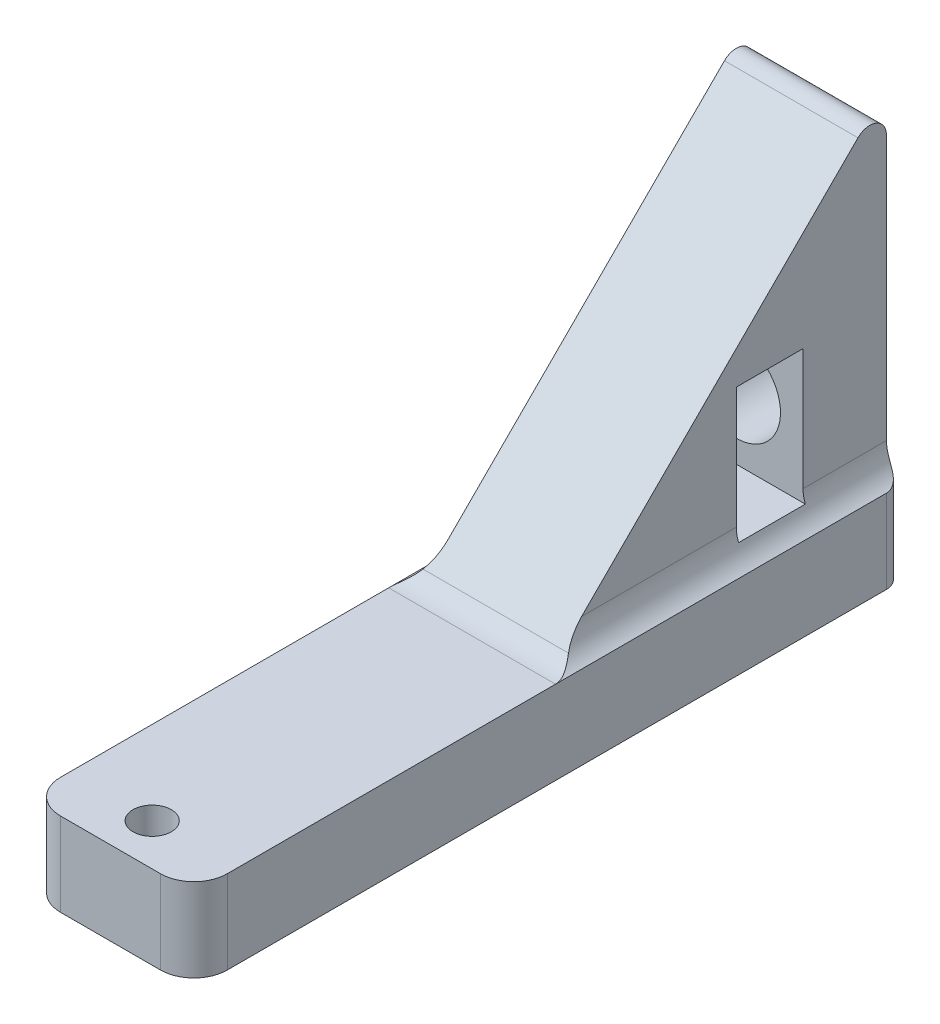
ISO-10303-21;
HEADER;
FILE_DESCRIPTION(('STEP AP214'),'2;1');
FILE_NAME('part.step','',(''),(''),'','','');
FILE_SCHEMA(('AUTOMOTIVE_DESIGN { 1 0 10303 214 1 1 1 1 }'));
ENDSEC;
DATA;
#1=APPLICATION_CONTEXT('core data for automotive mechanical design processes');
#2=APPLICATION_PROTOCOL_DEFINITION('international standard','automotive_design',2000,#1);
#3=PRODUCT_CONTEXT('',#1,'mechanical');
#4=PRODUCT('Part','Part','',(#3));
#5=PRODUCT_RELATED_PRODUCT_CATEGORY('part','',(#4));
#6=PRODUCT_DEFINITION_FORMATION('','',#4);
#7=PRODUCT_DEFINITION_CONTEXT('part definition',#1,'design');
#8=PRODUCT_DEFINITION('design','',#6,#7);
#9=PRODUCT_DEFINITION_SHAPE('','',#8);
#10=(LENGTH_UNIT() NAMED_UNIT(*) SI_UNIT(.MILLI.,.METRE.));
#11=(NAMED_UNIT(*) PLANE_ANGLE_UNIT() SI_UNIT($,.RADIAN.));
#12=(NAMED_UNIT(*) SI_UNIT($,.STERADIAN.) SOLID_ANGLE_UNIT());
#13=UNCERTAINTY_MEASURE_WITH_UNIT(LENGTH_MEASURE(1.E-05),#10,'distance_accuracy_value','');
#14=(GEOMETRIC_REPRESENTATION_CONTEXT(3) GLOBAL_UNCERTAINTY_ASSIGNED_CONTEXT((#13)) GLOBAL_UNIT_ASSIGNED_CONTEXT((#10,
#11,#12)) REPRESENTATION_CONTEXT('',''));
#15=CARTESIAN_POINT('',(0.,0.,0.));
#16=DIRECTION('',(0.,0.,1.));
#17=DIRECTION('',(1.,0.,0.));
#18=AXIS2_PLACEMENT_3D('',#15,#16,#17);
#19=CARTESIAN_POINT('',(0.,5.,0.));
#20=DIRECTION('',(0.,1.,0.));
#21=DIRECTION('',(0.,0.,1.));
#22=AXIS2_PLACEMENT_3D('',#19,#20,#21);
#23=PLANE('',#22);
#24=DIRECTION('',(0.,0.,1.));
#25=VECTOR('',#24,1.);
#26=CARTESIAN_POINT('',(0.,5.,0.));
#27=LINE('',#26,#25);
#28=CARTESIAN_POINT('',(0.,5.,20.8284271247462));
#29=VERTEX_POINT('',#28);
#30=CARTESIAN_POINT('',(0.,5.,40.5));
#31=VERTEX_POINT('',#30);
#32=EDGE_CURVE('E232',#29,#31,#27,.T.);
#33=ORIENTED_EDGE('',*,*,#32,.T.);
#34=CARTESIAN_POINT('',(2.,5.,40.5));
#35=DIRECTION('',(0.,1.,0.));
#36=DIRECTION('',(0.,0.,1.));
#37=AXIS2_PLACEMENT_3D('',#34,#35,#36);
#38=CIRCLE('',#37,2.);
#39=CARTESIAN_POINT('',(2.,5.,42.5));
#40=VERTEX_POINT('',#39);
#41=EDGE_CURVE('E257',#31,#40,#38,.T.);
#42=ORIENTED_EDGE('',*,*,#41,.T.);
#43=DIRECTION('',(1.,0.,0.));
#44=VECTOR('',#43,1.);
#45=CARTESIAN_POINT('',(0.,5.,42.5));
#46=LINE('',#45,#44);
#47=CARTESIAN_POINT('',(8.00000000000001,5.,42.5));
#48=VERTEX_POINT('',#47);
#49=EDGE_CURVE('E233',#40,#48,#46,.T.);
#50=ORIENTED_EDGE('',*,*,#49,.T.);
#51=CARTESIAN_POINT('',(8.00000000000001,5.,40.5));
#52=DIRECTION('',(0.,1.,0.));
#53=DIRECTION('',(0.,0.,1.));
#54=AXIS2_PLACEMENT_3D('',#51,#52,#53);
#55=CIRCLE('',#54,2.);
#56=CARTESIAN_POINT('',(10.,5.,40.5));
#57=VERTEX_POINT('',#56);
#58=EDGE_CURVE('E256',#48,#57,#55,.T.);
#59=ORIENTED_EDGE('',*,*,#58,.T.);
#60=DIRECTION('',(0.,0.,-1.));
#61=VECTOR('',#60,1.);
#62=CARTESIAN_POINT('',(10.,5.,0.));
#63=LINE('',#62,#61);
#64=CARTESIAN_POINT('',(10.,5.,20.8284271247462));
#65=VERTEX_POINT('',#64);
#66=EDGE_CURVE('E238',#57,#65,#63,.T.);
#67=ORIENTED_EDGE('',*,*,#66,.T.);
#68=DIRECTION('',(1.,0.,0.));
#69=VECTOR('',#68,1.);
#70=CARTESIAN_POINT('',(1.,5.,20.8284271247462));
#71=LINE('',#70,#69);
#72=EDGE_CURVE('E254',#65,#29,#71,.F.);
#73=ORIENTED_EDGE('',*,*,#72,.T.);
#74=EDGE_LOOP('',(#33,#42,#50,#59,#67,#73));
#75=FACE_BOUND('',#74,.T.);
#76=CARTESIAN_POINT('',(5.00000000000001,5.,40.));
#77=DIRECTION('',(0.,1.,0.));
#78=DIRECTION('',(0.,0.,1.));
#79=AXIS2_PLACEMENT_3D('',#76,#77,#78);
#80=CIRCLE('',#79,1.15);
#81=CARTESIAN_POINT('',(5.00000000000001,5.,41.15));
#82=VERTEX_POINT('',#81);
#83=EDGE_CURVE('E223',#82,#82,#80,.T.);
#84=ORIENTED_EDGE('',*,*,#83,.F.);
#85=EDGE_LOOP('',(#84));
#86=FACE_BOUND('',#85,.T.);
#87=ADVANCED_FACE('F39',(#75,#86),#23,.T.);
#88=CARTESIAN_POINT('',(0.,0.,0.));
#89=DIRECTION('',(0.,1.,0.));
#90=DIRECTION('',(0.,0.,1.));
#91=AXIS2_PLACEMENT_3D('',#88,#89,#90);
#92=PLANE('',#91);
#93=DIRECTION('',(0.,0.,1.));
#94=VECTOR('',#93,1.);
#95=CARTESIAN_POINT('',(0.,0.,0.));
#96=LINE('',#95,#94);
#97=CARTESIAN_POINT('',(0.,0.,1.));
#98=VERTEX_POINT('',#97);
#99=CARTESIAN_POINT('',(0.,0.,40.5));
#100=VERTEX_POINT('',#99);
#101=EDGE_CURVE('E227',#98,#100,#96,.T.);
#102=ORIENTED_EDGE('',*,*,#101,.F.);
#103=CARTESIAN_POINT('',(1.,0.,1.));
#104=DIRECTION('',(0.,1.,0.));
#105=DIRECTION('',(0.,0.,1.));
#106=AXIS2_PLACEMENT_3D('',#103,#104,#105);
#107=CIRCLE('',#106,1.);
#108=CARTESIAN_POINT('',(1.,0.,0.));
#109=VERTEX_POINT('',#108);
#110=EDGE_CURVE('E389',#98,#109,#107,.F.);
#111=ORIENTED_EDGE('',*,*,#110,.T.);
#112=DIRECTION('',(-1.,0.,0.));
#113=VECTOR('',#112,1.);
#114=CARTESIAN_POINT('',(0.,0.,0.));
#115=LINE('',#114,#113);
#116=CARTESIAN_POINT('',(9.,0.,0.));
#117=VERTEX_POINT('',#116);
#118=EDGE_CURVE('E248',#117,#109,#115,.T.);
#119=ORIENTED_EDGE('',*,*,#118,.F.);
#120=CARTESIAN_POINT('',(9.,0.,1.));
#121=DIRECTION('',(0.,1.,0.));
#122=DIRECTION('',(0.,0.,1.));
#123=AXIS2_PLACEMENT_3D('',#120,#121,#122);
#124=CIRCLE('',#123,1.);
#125=CARTESIAN_POINT('',(10.,0.,1.));
#126=VERTEX_POINT('',#125);
#127=EDGE_CURVE('E385',#117,#126,#124,.F.);
#128=ORIENTED_EDGE('',*,*,#127,.T.);
#129=DIRECTION('',(0.,0.,-1.));
#130=VECTOR('',#129,1.);
#131=CARTESIAN_POINT('',(10.,0.,0.));
#132=LINE('',#131,#130);
#133=CARTESIAN_POINT('',(10.,0.,40.5));
#134=VERTEX_POINT('',#133);
#135=EDGE_CURVE('E241',#134,#126,#132,.T.);
#136=ORIENTED_EDGE('',*,*,#135,.F.);
#137=CARTESIAN_POINT('',(8.00000000000001,0.,40.5));
#138=DIRECTION('',(0.,1.,0.));
#139=DIRECTION('',(0.,0.,1.));
#140=AXIS2_PLACEMENT_3D('',#137,#138,#139);
#141=CIRCLE('',#140,2.);
#142=CARTESIAN_POINT('',(8.00000000000001,0.,42.5));
#143=VERTEX_POINT('',#142);
#144=EDGE_CURVE('E277',#134,#143,#141,.F.);
#145=ORIENTED_EDGE('',*,*,#144,.T.);
#146=DIRECTION('',(1.,0.,0.));
#147=VECTOR('',#146,1.);
#148=CARTESIAN_POINT('',(0.,0.,42.5));
#149=LINE('',#148,#147);
#150=CARTESIAN_POINT('',(2.,0.,42.5));
#151=VERTEX_POINT('',#150);
#152=EDGE_CURVE('E244',#151,#143,#149,.T.);
#153=ORIENTED_EDGE('',*,*,#152,.F.);
#154=CARTESIAN_POINT('',(2.,0.,40.5));
#155=DIRECTION('',(0.,1.,0.));
#156=DIRECTION('',(0.,0.,1.));
#157=AXIS2_PLACEMENT_3D('',#154,#155,#156);
#158=CIRCLE('',#157,2.);
#159=EDGE_CURVE('E279',#151,#100,#158,.F.);
#160=ORIENTED_EDGE('',*,*,#159,.T.);
#161=EDGE_LOOP('',(#102,#111,#119,#128,#136,#145,#153,#160));
#162=FACE_BOUND('',#161,.T.);
#163=CARTESIAN_POINT('',(5.00000000000001,0.,40.));
#164=DIRECTION('',(0.,1.,0.));
#165=DIRECTION('',(0.,0.,1.));
#166=AXIS2_PLACEMENT_3D('',#163,#164,#165);
#167=CIRCLE('',#166,1.15);
#168=CARTESIAN_POINT('',(5.00000000000001,0.,41.15));
#169=VERTEX_POINT('',#168);
#170=EDGE_CURVE('E221',#169,#169,#167,.T.);
#171=ORIENTED_EDGE('',*,*,#170,.T.);
#172=EDGE_LOOP('',(#171));
#173=FACE_BOUND('',#172,.T.);
#174=ADVANCED_FACE('F402',(#162,#173),#92,.F.);
#175=CARTESIAN_POINT('',(0.,5.,0.));
#176=DIRECTION('',(1.,0.,0.));
#177=DIRECTION('',(0.,0.,-1.));
#178=AXIS2_PLACEMENT_3D('',#175,#176,#177);
#179=PLANE('',#178);
#180=CARTESIAN_POINT('',(0.,5.,1.));
#181=VERTEX_POINT('',#180);
#182=EDGE_CURVE('E231',#181,#29,#27,.T.);
#183=ORIENTED_EDGE('',*,*,#182,.F.);
#184=DIRECTION('',(0.,-1.,0.));
#185=VECTOR('',#184,1.);
#186=CARTESIAN_POINT('',(0.,5.,1.));
#187=LINE('',#186,#185);
#188=EDGE_CURVE('E310',#181,#98,#187,.T.);
#189=ORIENTED_EDGE('',*,*,#188,.T.);
#190=ORIENTED_EDGE('',*,*,#101,.T.);
#191=DIRECTION('',(0.,-1.,0.));
#192=VECTOR('',#191,1.);
#193=CARTESIAN_POINT('',(0.,5.,40.5));
#194=LINE('',#193,#192);
#195=EDGE_CURVE('E283',#100,#31,#194,.F.);
#196=ORIENTED_EDGE('',*,*,#195,.T.);
#197=ORIENTED_EDGE('',*,*,#32,.F.);
#198=EDGE_LOOP('',(#183,#189,#190,#196,#197));
#199=FACE_BOUND('',#198,.T.);
#200=ADVANCED_FACE('F400',(#199),#179,.F.);
#201=CARTESIAN_POINT('',(0.,5.,42.5));
#202=DIRECTION('',(0.,0.,-1.));
#203=DIRECTION('',(-1.,0.,0.));
#204=AXIS2_PLACEMENT_3D('',#201,#202,#203);
#205=PLANE('',#204);
#206=ORIENTED_EDGE('',*,*,#49,.F.);
#207=DIRECTION('',(0.,-1.,0.));
#208=VECTOR('',#207,1.);
#209=CARTESIAN_POINT('',(2.,5.,42.5));
#210=LINE('',#209,#208);
#211=EDGE_CURVE('E272',#40,#151,#210,.T.);
#212=ORIENTED_EDGE('',*,*,#211,.T.);
#213=ORIENTED_EDGE('',*,*,#152,.T.);
#214=DIRECTION('',(0.,-1.,0.));
#215=VECTOR('',#214,1.);
#216=CARTESIAN_POINT('',(8.00000000000001,5.,42.5));
#217=LINE('',#216,#215);
#218=EDGE_CURVE('E271',#143,#48,#217,.F.);
#219=ORIENTED_EDGE('',*,*,#218,.T.);
#220=EDGE_LOOP('',(#206,#212,#213,#219));
#221=FACE_BOUND('',#220,.T.);
#222=ADVANCED_FACE('F471',(#221),#205,.F.);
#223=CARTESIAN_POINT('',(10.,5.,0.));
#224=DIRECTION('',(-1.,0.,0.));
#225=DIRECTION('',(0.,0.,1.));
#226=AXIS2_PLACEMENT_3D('',#223,#224,#225);
#227=PLANE('',#226);
#228=ORIENTED_EDGE('',*,*,#135,.T.);
#229=DIRECTION('',(0.,-1.,0.));
#230=VECTOR('',#229,1.);
#231=CARTESIAN_POINT('',(10.,5.,1.));
#232=LINE('',#231,#230);
#233=CARTESIAN_POINT('',(10.,5.,1.));
#234=VERTEX_POINT('',#233);
#235=EDGE_CURVE('E350',#126,#234,#232,.F.);
#236=ORIENTED_EDGE('',*,*,#235,.T.);
#237=EDGE_CURVE('E240',#65,#234,#63,.T.);
#238=ORIENTED_EDGE('',*,*,#237,.F.);
#239=ORIENTED_EDGE('',*,*,#66,.F.);
#240=DIRECTION('',(0.,-1.,0.));
#241=VECTOR('',#240,1.);
#242=CARTESIAN_POINT('',(10.,5.,40.5));
#243=LINE('',#242,#241);
#244=EDGE_CURVE('E282',#57,#134,#243,.T.);
#245=ORIENTED_EDGE('',*,*,#244,.T.);
#246=EDGE_LOOP('',(#228,#236,#238,#239,#245));
#247=FACE_BOUND('',#246,.T.);
#248=ADVANCED_FACE('F371',(#247),#227,.F.);
#249=CARTESIAN_POINT('',(0.,5.,0.));
#250=DIRECTION('',(0.,0.,1.));
#251=DIRECTION('',(1.,0.,0.));
#252=AXIS2_PLACEMENT_3D('',#249,#250,#251);
#253=PLANE('',#252);
#254=CARTESIAN_POINT('',(5.,10.,0.));
#255=DIRECTION('',(0.,0.,-1.));
#256=DIRECTION('',(-1.,0.,0.));
#257=AXIS2_PLACEMENT_3D('',#254,#255,#256);
#258=CIRCLE('',#257,2.65);
#259=CARTESIAN_POINT('',(2.35,10.,0.));
#260=VERTEX_POINT('',#259);
#261=EDGE_CURVE('E207',#260,#260,#258,.T.);
#262=ORIENTED_EDGE('',*,*,#261,.F.);
#263=EDGE_LOOP('',(#262));
#264=FACE_BOUND('',#263,.T.);
#265=ORIENTED_EDGE('',*,*,#118,.T.);
#266=DIRECTION('',(0.,-1.,0.));
#267=VECTOR('',#266,1.);
#268=CARTESIAN_POINT('',(1.,5.,0.));
#269=LINE('',#268,#267);
#270=CARTESIAN_POINT('',(1.,6.73205080756888,0.));
#271=VERTEX_POINT('',#270);
#272=EDGE_CURVE('E346',#109,#271,#269,.F.);
#273=ORIENTED_EDGE('',*,*,#272,.T.);
#274=DIRECTION('',(0.,1.,0.));
#275=VECTOR('',#274,1.);
#276=CARTESIAN_POINT('',(1.,25.,0.));
#277=LINE('',#276,#275);
#278=CARTESIAN_POINT('',(1.,22.5857864376269,0.));
#279=VERTEX_POINT('',#278);
#280=EDGE_CURVE('E218',#271,#279,#277,.T.);
#281=ORIENTED_EDGE('',*,*,#280,.T.);
#282=DIRECTION('',(1.,0.,0.));
#283=VECTOR('',#282,1.);
#284=CARTESIAN_POINT('',(9.,22.5857864376269,0.));
#285=LINE('',#284,#283);
#286=CARTESIAN_POINT('',(9.,22.5857864376269,0.));
#287=VERTEX_POINT('',#286);
#288=EDGE_CURVE('E387',#279,#287,#285,.T.);
#289=ORIENTED_EDGE('',*,*,#288,.T.);
#290=DIRECTION('',(0.,1.,0.));
#291=VECTOR('',#290,1.);
#292=CARTESIAN_POINT('',(9.,25.,0.));
#293=LINE('',#292,#291);
#294=CARTESIAN_POINT('',(9.,6.73205080756888,0.));
#295=VERTEX_POINT('',#294);
#296=EDGE_CURVE('E213',#295,#287,#293,.T.);
#297=ORIENTED_EDGE('',*,*,#296,.F.);
#298=DIRECTION('',(0.,-1.,0.));
#299=VECTOR('',#298,1.);
#300=CARTESIAN_POINT('',(9.,5.,0.));
#301=LINE('',#300,#299);
#302=EDGE_CURVE('E381',#295,#117,#301,.T.);
#303=ORIENTED_EDGE('',*,*,#302,.T.);
#304=EDGE_LOOP('',(#265,#273,#281,#289,#297,#303));
#305=FACE_BOUND('',#304,.T.);
#306=ADVANCED_FACE('F419',(#264,#305),#253,.F.);
#307=CARTESIAN_POINT('',(5.00000000000001,5.,40.));
#308=DIRECTION('',(0.,-1.,0.));
#309=DIRECTION('',(0.,0.,-1.));
#310=AXIS2_PLACEMENT_3D('',#307,#308,#309);
#311=CYLINDRICAL_SURFACE('',#310,1.15);
#312=ORIENTED_EDGE('',*,*,#83,.T.);
#313=EDGE_LOOP('',(#312));
#314=FACE_BOUND('',#313,.T.);
#315=ORIENTED_EDGE('',*,*,#170,.F.);
#316=EDGE_LOOP('',(#315));
#317=FACE_BOUND('',#316,.T.);
#318=ADVANCED_FACE('F461',(#314,#317),#311,.F.);
#319=CARTESIAN_POINT('',(1.,5.,20.));
#320=DIRECTION('',(0.,0.707106781186547,0.707106781186548));
#321=DIRECTION('',(0.,-0.707106781186548,0.707106781186547));
#322=AXIS2_PLACEMENT_3D('',#319,#320,#321);
#323=PLANE('',#322);
#324=DIRECTION('',(0.,-0.707106781186548,0.707106781186547));
#325=VECTOR('',#324,1.);
#326=CARTESIAN_POINT('',(9.,5.,20.));
#327=LINE('',#326,#325);
#328=CARTESIAN_POINT('',(9.,23.2928932188135,1.70710678118655));
#329=VERTEX_POINT('',#328);
#330=CARTESIAN_POINT('',(9.,6.73205080756888,18.2679491924311));
#331=VERTEX_POINT('',#330);
#332=EDGE_CURVE('E220',#329,#331,#327,.T.);
#333=ORIENTED_EDGE('',*,*,#332,.F.);
#334=DIRECTION('',(1.,0.,0.));
#335=VECTOR('',#334,1.);
#336=CARTESIAN_POINT('',(1.,23.2928932188135,1.70710678118655));
#337=LINE('',#336,#335);
#338=CARTESIAN_POINT('',(1.,23.2928932188135,1.70710678118655));
#339=VERTEX_POINT('',#338);
#340=EDGE_CURVE('E50',#329,#339,#337,.F.);
#341=ORIENTED_EDGE('',*,*,#340,.T.);
#342=DIRECTION('',(0.,-0.707106781186548,0.707106781186547));
#343=VECTOR('',#342,1.);
#344=CARTESIAN_POINT('',(1.,5.,20.));
#345=LINE('',#344,#343);
#346=CARTESIAN_POINT('',(1.,6.73205080756888,18.2679491924311));
#347=VERTEX_POINT('',#346);
#348=EDGE_CURVE('E225',#339,#347,#345,.T.);
#349=ORIENTED_EDGE('',*,*,#348,.T.);
#350=CARTESIAN_POINT('',(-1.,6.73205080756888,18.2679491924311));
#351=DIRECTION('',(0.,0.707106781186547,0.707106781186548));
#352=DIRECTION('',(0.,0.707106781186548,-0.707106781186547));
#353=AXIS2_PLACEMENT_3D('',#350,#351,#352);
#354=ELLIPSE('',#353,2.82842712474619,2.);
#355=CARTESIAN_POINT('',(0.638925865987091,5.58578643762691,19.4142135623731));
#356=VERTEX_POINT('',#355);
#357=EDGE_CURVE('E298',#347,#356,#354,.F.);
#358=ORIENTED_EDGE('',*,*,#357,.T.);
#359=DIRECTION('',(1.,0.,0.));
#360=VECTOR('',#359,1.);
#361=CARTESIAN_POINT('',(9.,5.58578643762691,19.4142135623731));
#362=LINE('',#361,#360);
#363=CARTESIAN_POINT('',(9.36107413401292,5.58578643762691,19.4142135623731));
#364=VERTEX_POINT('',#363);
#365=EDGE_CURVE('E286',#356,#364,#362,.T.);
#366=ORIENTED_EDGE('',*,*,#365,.T.);
#367=CARTESIAN_POINT('',(11.,6.73205080756888,18.2679491924311));
#368=DIRECTION('',(0.,0.707106781186547,0.707106781186548));
#369=DIRECTION('',(0.,-0.707106781186548,0.707106781186547));
#370=AXIS2_PLACEMENT_3D('',#367,#368,#369);
#371=ELLIPSE('',#370,2.82842712474619,2.);
#372=EDGE_CURVE('E308',#364,#331,#371,.F.);
#373=ORIENTED_EDGE('',*,*,#372,.T.);
#374=EDGE_LOOP('',(#333,#341,#349,#358,#366,#373));
#375=FACE_BOUND('',#374,.T.);
#376=ADVANCED_FACE('F499',(#375),#323,.T.);
#377=CARTESIAN_POINT('',(1.,0.,0.));
#378=DIRECTION('',(-1.,0.,0.));
#379=DIRECTION('',(0.,0.,1.));
#380=AXIS2_PLACEMENT_3D('',#377,#378,#379);
#381=PLANE('',#380);
#382=ORIENTED_EDGE('',*,*,#348,.F.);
#383=CARTESIAN_POINT('',(1.,22.5857864376269,1.));
#384=DIRECTION('',(-1.,0.,0.));
#385=DIRECTION('',(0.,0.,1.));
#386=AXIS2_PLACEMENT_3D('',#383,#384,#385);
#387=CIRCLE('',#386,1.);
#388=EDGE_CURVE('E11',#339,#279,#387,.T.);
#389=ORIENTED_EDGE('',*,*,#388,.T.);
#390=ORIENTED_EDGE('',*,*,#280,.F.);
#391=DIRECTION('',(0.,0.,1.));
#392=VECTOR('',#391,1.);
#393=CARTESIAN_POINT('',(1.,6.73205080756888,20.));
#394=LINE('',#393,#392);
#395=CARTESIAN_POINT('',(1.,6.73205080756888,5.));
#396=VERTEX_POINT('',#395);
#397=EDGE_CURVE('E264',#271,#396,#394,.T.);
#398=ORIENTED_EDGE('',*,*,#397,.T.);
#399=DIRECTION('',(0.,-1.,0.));
#400=VECTOR('',#399,1.);
#401=CARTESIAN_POINT('',(1.,0.,5.));
#402=LINE('',#401,#400);
#403=CARTESIAN_POINT('',(1.,14.,5.));
#404=VERTEX_POINT('',#403);
#405=EDGE_CURVE('E201',#404,#396,#402,.T.);
#406=ORIENTED_EDGE('',*,*,#405,.F.);
#407=DIRECTION('',(0.,0.,-1.));
#408=VECTOR('',#407,1.);
#409=CARTESIAN_POINT('',(1.,14.,0.));
#410=LINE('',#409,#408);
#411=CARTESIAN_POINT('',(1.,14.,9.));
#412=VERTEX_POINT('',#411);
#413=EDGE_CURVE('E190',#412,#404,#410,.T.);
#414=ORIENTED_EDGE('',*,*,#413,.F.);
#415=DIRECTION('',(0.,1.,0.));
#416=VECTOR('',#415,1.);
#417=CARTESIAN_POINT('',(1.,0.,9.));
#418=LINE('',#417,#416);
#419=CARTESIAN_POINT('',(1.,6.73205080756888,9.));
#420=VERTEX_POINT('',#419);
#421=EDGE_CURVE('E206',#420,#412,#418,.T.);
#422=ORIENTED_EDGE('',*,*,#421,.F.);
#423=DIRECTION('',(0.,0.,1.));
#424=VECTOR('',#423,1.);
#425=CARTESIAN_POINT('',(1.,6.73205080756888,20.));
#426=LINE('',#425,#424);
#427=EDGE_CURVE('E265',#420,#347,#426,.T.);
#428=ORIENTED_EDGE('',*,*,#427,.T.);
#429=EDGE_LOOP('',(#382,#389,#390,#398,#406,#414,#422,#428));
#430=FACE_BOUND('',#429,.T.);
#431=ADVANCED_FACE('F421',(#430),#381,.T.);
#432=CARTESIAN_POINT('',(9.,0.,0.));
#433=DIRECTION('',(-1.,0.,0.));
#434=DIRECTION('',(0.,0.,1.));
#435=AXIS2_PLACEMENT_3D('',#432,#433,#434);
#436=PLANE('',#435);
#437=ORIENTED_EDGE('',*,*,#296,.T.);
#438=CARTESIAN_POINT('',(9.,22.5857864376269,1.));
#439=DIRECTION('',(-1.,0.,0.));
#440=DIRECTION('',(0.,0.,1.));
#441=AXIS2_PLACEMENT_3D('',#438,#439,#440);
#442=CIRCLE('',#441,1.);
#443=EDGE_CURVE('E63',#287,#329,#442,.F.);
#444=ORIENTED_EDGE('',*,*,#443,.T.);
#445=ORIENTED_EDGE('',*,*,#332,.T.);
#446=DIRECTION('',(0.,0.,1.));
#447=VECTOR('',#446,1.);
#448=CARTESIAN_POINT('',(9.,6.73205080756888,0.));
#449=LINE('',#448,#447);
#450=CARTESIAN_POINT('',(9.,6.73205080756888,9.));
#451=VERTEX_POINT('',#450);
#452=EDGE_CURVE('E267',#331,#451,#449,.F.);
#453=ORIENTED_EDGE('',*,*,#452,.T.);
#454=DIRECTION('',(0.,-1.,0.));
#455=VECTOR('',#454,1.);
#456=CARTESIAN_POINT('',(9.,14.,9.));
#457=LINE('',#456,#455);
#458=CARTESIAN_POINT('',(9.,14.,9.));
#459=VERTEX_POINT('',#458);
#460=EDGE_CURVE('E182',#459,#451,#457,.T.);
#461=ORIENTED_EDGE('',*,*,#460,.F.);
#462=DIRECTION('',(0.,0.,1.));
#463=VECTOR('',#462,1.);
#464=CARTESIAN_POINT('',(9.,14.,9.));
#465=LINE('',#464,#463);
#466=CARTESIAN_POINT('',(9.,14.,5.));
#467=VERTEX_POINT('',#466);
#468=EDGE_CURVE('E179',#467,#459,#465,.T.);
#469=ORIENTED_EDGE('',*,*,#468,.F.);
#470=DIRECTION('',(0.,1.,0.));
#471=VECTOR('',#470,1.);
#472=CARTESIAN_POINT('',(9.,14.,5.));
#473=LINE('',#472,#471);
#474=CARTESIAN_POINT('',(9.,6.73205080756888,5.));
#475=VERTEX_POINT('',#474);
#476=EDGE_CURVE('E169',#475,#467,#473,.T.);
#477=ORIENTED_EDGE('',*,*,#476,.F.);
#478=DIRECTION('',(0.,0.,1.));
#479=VECTOR('',#478,1.);
#480=CARTESIAN_POINT('',(9.,6.73205080756888,0.));
#481=LINE('',#480,#479);
#482=EDGE_CURVE('E270',#475,#295,#481,.F.);
#483=ORIENTED_EDGE('',*,*,#482,.T.);
#484=EDGE_LOOP('',(#437,#444,#445,#453,#461,#469,#477,#483));
#485=FACE_BOUND('',#484,.T.);
#486=ADVANCED_FACE('F193',(#485),#436,.F.);
#487=CARTESIAN_POINT('',(5.,10.,12.));
#488=DIRECTION('',(0.,0.,-1.));
#489=DIRECTION('',(-1.,0.,0.));
#490=AXIS2_PLACEMENT_3D('',#487,#488,#489);
#491=CYLINDRICAL_SURFACE('',#490,2.65);
#492=CARTESIAN_POINT('',(5.,10.,5.));
#493=DIRECTION('',(0.,0.,-1.));
#494=DIRECTION('',(0.,1.,0.));
#495=AXIS2_PLACEMENT_3D('',#492,#493,#494);
#496=CIRCLE('',#495,2.65);
#497=CARTESIAN_POINT('',(5.,12.65,5.));
#498=VERTEX_POINT('',#497);
#499=EDGE_CURVE('E199',#498,#498,#496,.F.);
#500=ORIENTED_EDGE('',*,*,#499,.T.);
#501=EDGE_LOOP('',(#500));
#502=FACE_BOUND('',#501,.T.);
#503=ORIENTED_EDGE('',*,*,#261,.T.);
#504=EDGE_LOOP('',(#503));
#505=FACE_BOUND('',#504,.T.);
#506=ADVANCED_FACE('F437',(#502,#505),#491,.F.);
#507=CARTESIAN_POINT('',(0.,14.,9.));
#508=DIRECTION('',(0.,0.,1.));
#509=DIRECTION('',(0.,-1.,0.));
#510=AXIS2_PLACEMENT_3D('',#507,#508,#509);
#511=PLANE('',#510);
#512=DIRECTION('',(1.,0.,0.));
#513=VECTOR('',#512,1.);
#514=CARTESIAN_POINT('',(0.,6.,9.));
#515=LINE('',#514,#513);
#516=CARTESIAN_POINT('',(0.861209718204503,6.,9.));
#517=VERTEX_POINT('',#516);
#518=CARTESIAN_POINT('',(9.1387902817955,6.,9.));
#519=VERTEX_POINT('',#518);
#520=EDGE_CURVE('E194',#517,#519,#515,.T.);
#521=ORIENTED_EDGE('',*,*,#520,.F.);
#522=CARTESIAN_POINT('',(-1.,6.73205080756888,9.));
#523=DIRECTION('',(0.,0.,1.));
#524=DIRECTION('',(0.,-1.,0.));
#525=AXIS2_PLACEMENT_3D('',#522,#523,#524);
#526=CIRCLE('',#525,2.);
#527=EDGE_CURVE('E294',#517,#420,#526,.T.);
#528=ORIENTED_EDGE('',*,*,#527,.T.);
#529=ORIENTED_EDGE('',*,*,#421,.T.);
#530=DIRECTION('',(1.,0.,0.));
#531=VECTOR('',#530,1.);
#532=CARTESIAN_POINT('',(0.,14.,9.));
#533=LINE('',#532,#531);
#534=EDGE_CURVE('E186',#412,#459,#533,.T.);
#535=ORIENTED_EDGE('',*,*,#534,.T.);
#536=ORIENTED_EDGE('',*,*,#460,.T.);
#537=CARTESIAN_POINT('',(11.,6.73205080756888,9.));
#538=DIRECTION('',(0.,0.,1.));
#539=DIRECTION('',(0.,-1.,0.));
#540=AXIS2_PLACEMENT_3D('',#537,#538,#539);
#541=CIRCLE('',#540,2.);
#542=EDGE_CURVE('E300',#451,#519,#541,.T.);
#543=ORIENTED_EDGE('',*,*,#542,.T.);
#544=EDGE_LOOP('',(#521,#528,#529,#535,#536,#543));
#545=FACE_BOUND('',#544,.T.);
#546=CARTESIAN_POINT('',(5.,10.,9.));
#547=DIRECTION('',(0.,0.,1.));
#548=DIRECTION('',(0.,-1.,0.));
#549=AXIS2_PLACEMENT_3D('',#546,#547,#548);
#550=CIRCLE('',#549,2.65);
#551=CARTESIAN_POINT('',(5.,7.35,9.));
#552=VERTEX_POINT('',#551);
#553=EDGE_CURVE('E202',#552,#552,#550,.F.);
#554=ORIENTED_EDGE('',*,*,#553,.F.);
#555=EDGE_LOOP('',(#554));
#556=FACE_BOUND('',#555,.T.);
#557=ADVANCED_FACE('F432',(#545,#556),#511,.F.);
#558=CARTESIAN_POINT('',(0.,14.,5.));
#559=DIRECTION('',(0.,0.,-1.));
#560=DIRECTION('',(0.,1.,0.));
#561=AXIS2_PLACEMENT_3D('',#558,#559,#560);
#562=PLANE('',#561);
#563=ORIENTED_EDGE('',*,*,#405,.T.);
#564=CARTESIAN_POINT('',(-1.,6.73205080756888,5.));
#565=DIRECTION('',(0.,0.,-1.));
#566=DIRECTION('',(0.,1.,0.));
#567=AXIS2_PLACEMENT_3D('',#564,#565,#566);
#568=CIRCLE('',#567,2.);
#569=CARTESIAN_POINT('',(0.861209718204503,6.,5.));
#570=VERTEX_POINT('',#569);
#571=EDGE_CURVE('E288',#396,#570,#568,.T.);
#572=ORIENTED_EDGE('',*,*,#571,.T.);
#573=DIRECTION('',(1.,0.,0.));
#574=VECTOR('',#573,1.);
#575=CARTESIAN_POINT('',(0.,6.,5.));
#576=LINE('',#575,#574);
#577=CARTESIAN_POINT('',(9.1387902817955,6.,5.));
#578=VERTEX_POINT('',#577);
#579=EDGE_CURVE('E191',#570,#578,#576,.T.);
#580=ORIENTED_EDGE('',*,*,#579,.T.);
#581=CARTESIAN_POINT('',(11.,6.73205080756888,5.));
#582=DIRECTION('',(0.,0.,-1.));
#583=DIRECTION('',(0.,1.,0.));
#584=AXIS2_PLACEMENT_3D('',#581,#582,#583);
#585=CIRCLE('',#584,2.);
#586=EDGE_CURVE('E176',#578,#475,#585,.T.);
#587=ORIENTED_EDGE('',*,*,#586,.T.);
#588=ORIENTED_EDGE('',*,*,#476,.T.);
#589=DIRECTION('',(1.,0.,0.));
#590=VECTOR('',#589,1.);
#591=CARTESIAN_POINT('',(0.,14.,5.));
#592=LINE('',#591,#590);
#593=EDGE_CURVE('E172',#404,#467,#592,.T.);
#594=ORIENTED_EDGE('',*,*,#593,.F.);
#595=EDGE_LOOP('',(#563,#572,#580,#587,#588,#594));
#596=FACE_BOUND('',#595,.T.);
#597=ORIENTED_EDGE('',*,*,#499,.F.);
#598=EDGE_LOOP('',(#597));
#599=FACE_BOUND('',#598,.T.);
#600=ADVANCED_FACE('F173',(#596,#599),#562,.F.);
#601=CARTESIAN_POINT('',(0.,14.,9.));
#602=DIRECTION('',(0.,1.,0.));
#603=DIRECTION('',(0.,0.,1.));
#604=AXIS2_PLACEMENT_3D('',#601,#602,#603);
#605=PLANE('',#604);
#606=ORIENTED_EDGE('',*,*,#413,.T.);
#607=ORIENTED_EDGE('',*,*,#593,.T.);
#608=ORIENTED_EDGE('',*,*,#468,.T.);
#609=ORIENTED_EDGE('',*,*,#534,.F.);
#610=EDGE_LOOP('',(#606,#607,#608,#609));
#611=FACE_BOUND('',#610,.T.);
#612=ADVANCED_FACE('F183',(#611),#605,.F.);
#613=CARTESIAN_POINT('',(0.,6.,9.));
#614=DIRECTION('',(0.,-1.,0.));
#615=DIRECTION('',(0.,0.,-1.));
#616=AXIS2_PLACEMENT_3D('',#613,#614,#615);
#617=PLANE('',#616);
#618=ORIENTED_EDGE('',*,*,#579,.F.);
#619=DIRECTION('',(0.,0.,-1.));
#620=VECTOR('',#619,1.);
#621=CARTESIAN_POINT('',(0.861209718204503,6.,5.));
#622=LINE('',#621,#620);
#623=EDGE_CURVE('E292',#570,#517,#622,.F.);
#624=ORIENTED_EDGE('',*,*,#623,.T.);
#625=ORIENTED_EDGE('',*,*,#520,.T.);
#626=DIRECTION('',(0.,0.,1.));
#627=VECTOR('',#626,1.);
#628=CARTESIAN_POINT('',(9.1387902817955,6.,9.));
#629=LINE('',#628,#627);
#630=EDGE_CURVE('E305',#519,#578,#629,.F.);
#631=ORIENTED_EDGE('',*,*,#630,.T.);
#632=EDGE_LOOP('',(#618,#624,#625,#631));
#633=FACE_BOUND('',#632,.T.);
#634=ADVANCED_FACE('F429',(#633),#617,.F.);
#635=CARTESIAN_POINT('',(5.,10.,12.));
#636=DIRECTION('',(0.,0.,-1.));
#637=DIRECTION('',(-1.,0.,0.));
#638=AXIS2_PLACEMENT_3D('',#635,#636,#637);
#639=PLANE('',#638);
#640=CARTESIAN_POINT('',(5.,10.,12.));
#641=DIRECTION('',(0.,0.,-1.));
#642=DIRECTION('',(-1.,0.,0.));
#643=AXIS2_PLACEMENT_3D('',#640,#641,#642);
#644=CIRCLE('',#643,2.65);
#645=CARTESIAN_POINT('',(2.35,10.,12.));
#646=VERTEX_POINT('',#645);
#647=EDGE_CURVE('E209',#646,#646,#644,.T.);
#648=ORIENTED_EDGE('',*,*,#647,.T.);
#649=EDGE_LOOP('',(#648));
#650=FACE_BOUND('',#649,.T.);
#651=ADVANCED_FACE('F443',(#650),#639,.T.);
#652=ORIENTED_EDGE('',*,*,#553,.T.);
#653=EDGE_LOOP('',(#652));
#654=FACE_BOUND('',#653,.T.);
#655=ORIENTED_EDGE('',*,*,#647,.F.);
#656=EDGE_LOOP('',(#655));
#657=FACE_BOUND('',#656,.T.);
#658=ADVANCED_FACE('F445',(#654,#657),#491,.F.);
#659=CARTESIAN_POINT('',(11.,6.73205080756888,0.));
#660=DIRECTION('',(0.,0.,1.));
#661=DIRECTION('',(1.,0.,0.));
#662=AXIS2_PLACEMENT_3D('',#659,#660,#661);
#663=CYLINDRICAL_SURFACE('',#662,2.);
#664=ORIENTED_EDGE('',*,*,#237,.T.);
#665=CARTESIAN_POINT('',(10.,5.,1.));
#666=CARTESIAN_POINT('',(10.0000011285419,5.00000238200471,0.975493807461149));
#667=CARTESIAN_POINT('',(9.99909841268645,5.00052019251154,0.950999437805855));
#668=CARTESIAN_POINT('',(9.99550584759739,5.00260064709355,0.902188284655933));
#669=CARTESIAN_POINT('',(9.99281610617474,5.0041632281379,0.877871490537665));
#670=CARTESIAN_POINT('',(9.98211316929418,5.01042971936393,0.805523154543291));
#671=CARTESIAN_POINT('',(9.97146606282451,5.01671227254248,0.75798144367334));
#672=CARTESIAN_POINT('',(9.94368636451555,5.03368012901133,0.665658265945809));
#673=CARTESIAN_POINT('',(9.92655021177649,5.04436784994698,0.620878330345458));
#674=CARTESIAN_POINT('',(9.88673427834684,5.0703643796506,0.535321125025126));
#675=CARTESIAN_POINT('',(9.86405638553605,5.08567161512562,0.49454249881354));
#676=CARTESIAN_POINT('',(9.81429536674187,5.12113827273561,0.417737189244069));
#677=CARTESIAN_POINT('',(9.78718768732014,5.14132505853764,0.381739143961553));
#678=CARTESIAN_POINT('',(9.73019510464175,5.18643923394312,0.315360449712121));
#679=CARTESIAN_POINT('',(9.70030925257878,5.2113682461839,0.284981730535922));
#680=CARTESIAN_POINT('',(9.63745544965921,5.26735081771478,0.228279482044483));
#681=CARTESIAN_POINT('',(9.6044111463443,5.29868756448453,0.202322331460829));
#682=CARTESIAN_POINT('',(9.53864392254221,5.36579520728899,0.156511889385715));
#683=CARTESIAN_POINT('',(9.50592113269455,5.40156783135822,0.136660987184015));
#684=CARTESIAN_POINT('',(9.42607599123841,5.49583280738654,0.0936736303810242));
#685=CARTESIAN_POINT('',(9.3799702698838,5.55671637895135,0.0738893758163249));
#686=CARTESIAN_POINT('',(9.29421140928746,5.68501426826064,0.0431663494168943));
#687=CARTESIAN_POINT('',(9.25457774039165,5.75244735306222,0.0322538892326037));
#688=CARTESIAN_POINT('',(9.1950598478313,5.86894283314402,0.0189062515929975));
#689=CARTESIAN_POINT('',(9.17297277477697,5.9167307831192,0.0148622650732826));
#690=CARTESIAN_POINT('',(9.13260110379519,6.01400341568273,0.00861943112009918));
#691=CARTESIAN_POINT('',(9.11431636780371,6.06348803658841,0.00642051668269803));
#692=CARTESIAN_POINT('',(9.08171126773081,6.16376506318755,0.0032093754919531));
#693=CARTESIAN_POINT('',(9.06739005368397,6.21455718593358,0.00219689416073239));
#694=CARTESIAN_POINT('',(9.04280941032637,6.31710044129717,0.000841393909972576));
#695=CARTESIAN_POINT('',(9.03254830182398,6.36885116816242,0.00049809799540934));
#696=CARTESIAN_POINT('',(9.01623807313208,6.47242522770892,9.70373571793075E-05));
#697=CARTESIAN_POINT('',(9.01014360260162,6.5242414206407,3.61551922280946E-05));
#698=CARTESIAN_POINT('',(9.00202767240192,6.62805568175385,8.61743321007592E-07));
#699=CARTESIAN_POINT('',(8.99999562526871,6.68005292244038,2.62252187469435E-05));
#700=CARTESIAN_POINT('',(9.,6.73205080756888,0.));
#701=B_SPLINE_CURVE_WITH_KNOTS('',3,(#665,#666,#667,#668,#669,#670,#671,#672,#673,#674,#675,
#676,#677,#678,#679,#680,#681,#682,#683,#684,#685,#686,#687,#688,#689,#690,#691,#692,#693,#694,
#695,#696,#697,#698,#699,#700),.UNSPECIFIED.,.F.,.F.,(4,2,2,2,2,2,2,2,2,2,2,2,2,2,2,2,2,4),(0.,
0.0734730092421059,0.146941586269949,0.293546427375403,0.440231835551166,0.586867342557678,
0.7343450532598,0.881873317153268,1.03851399854113,1.19521589350433,1.43057310669216,
1.66662581337479,1.82484159170341,1.98305162416534,2.14122770262389,2.29933829355508,
2.4556993510749,2.61165236729908),.UNSPECIFIED.);
#702=EDGE_CURVE('E363',#234,#295,#701,.T.);
#703=ORIENTED_EDGE('',*,*,#702,.T.);
#704=ORIENTED_EDGE('',*,*,#482,.F.);
#705=ORIENTED_EDGE('',*,*,#586,.F.);
#706=ORIENTED_EDGE('',*,*,#630,.F.);
#707=ORIENTED_EDGE('',*,*,#542,.F.);
#708=ORIENTED_EDGE('',*,*,#452,.F.);
#709=ORIENTED_EDGE('',*,*,#372,.F.);
#710=CARTESIAN_POINT('',(10.,5.,20.8284271247462));
#711=CARTESIAN_POINT('',(10.0000258736217,4.99999348262065,20.7946441416));
#712=CARTESIAN_POINT('',(9.99851598657476,5.00085627432544,20.7608886777489));
#713=CARTESIAN_POINT('',(9.99265472349014,5.00425634819458,20.693790210772));
#714=CARTESIAN_POINT('',(9.98831026861842,5.00678955187309,20.6604464040415));
#715=CARTESIAN_POINT('',(9.97155045839175,5.01669103999539,20.5624525275417));
#716=CARTESIAN_POINT('',(9.95539257167193,5.02636615560321,20.4986657280451));
#717=CARTESIAN_POINT('',(9.90678400287206,5.05693561171176,20.3455515178355));
#718=CARTESIAN_POINT('',(9.87024770589954,5.0809606401822,20.2582289161072));
#719=CARTESIAN_POINT('',(9.78938697364609,5.13927122635455,20.0896736492533));
#720=CARTESIAN_POINT('',(9.74496511324918,5.17368943098801,20.0085378044456));
#721=CARTESIAN_POINT('',(9.670906479754,5.23708791536819,19.882360232424));
#722=CARTESIAN_POINT('',(9.64207935430325,5.26314992297573,19.8353369098921));
#723=CARTESIAN_POINT('',(9.58416119995334,5.31889365188957,19.743640086242));
#724=CARTESIAN_POINT('',(9.55507014336454,5.34857575715023,19.6989668350972));
#725=CARTESIAN_POINT('',(9.49792696065568,5.41086788020855,19.6129362813781));
#726=CARTESIAN_POINT('',(9.46986607919403,5.44339875156598,19.5715275333931));
#727=CARTESIAN_POINT('',(9.41465529212292,5.511959569793,19.4910720930659));
#728=CARTESIAN_POINT('',(9.38750536725167,5.5479894426149,19.452025350766));
#729=CARTESIAN_POINT('',(9.36107413401291,5.5857864376269,19.4142135623731));
#730=B_SPLINE_CURVE_WITH_KNOTS('',3,(#710,#711,#712,#713,#714,#715,#716,#717,#718,#719,#720,
#721,#722,#723,#724,#725,#726,#727,#728,#729),.UNSPECIFIED.,.F.,.F.,(4,2,2,2,2,2,2,2,2,4),(0.,
0.101257329490736,0.202268339511765,0.400825920733767,0.692232696058335,0.987528257321859,
1.17040232375534,1.35329580305123,1.53214981548989,1.71100004375185),.UNSPECIFIED.);
#731=EDGE_CURVE('E317',#65,#364,#730,.T.);
#732=ORIENTED_EDGE('',*,*,#731,.F.);
#733=EDGE_LOOP('',(#664,#703,#704,#705,#706,#707,#708,#709,#732));
#734=FACE_BOUND('',#733,.T.);
#735=ADVANCED_FACE('F331',(#734),#663,.F.);
#736=CARTESIAN_POINT('',(1.,7.,20.8284271247462));
#737=DIRECTION('',(-1.,0.,0.));
#738=DIRECTION('',(0.,0.,1.));
#739=AXIS2_PLACEMENT_3D('',#736,#737,#738);
#740=CYLINDRICAL_SURFACE('',#739,2.);
#741=ORIENTED_EDGE('',*,*,#365,.F.);
#742=CARTESIAN_POINT('',(0.638925865987091,5.58578643762691,19.4142135623731));
#743=CARTESIAN_POINT('',(0.608618950546778,5.54244150645852,19.4575856253645));
#744=CARTESIAN_POINT('',(0.577359965113649,5.50141916623114,19.5025689382066));
#745=CARTESIAN_POINT('',(0.513728920099585,5.42394861176575,19.595645687679));
#746=CARTESIAN_POINT('',(0.48135622489872,5.38750306669188,19.6437409146175));
#747=CARTESIAN_POINT('',(0.415565876685385,5.31836658826016,19.7440370689615));
#748=CARTESIAN_POINT('',(0.382141485558805,5.2857833282322,19.7963076868974));
#749=CARTESIAN_POINT('',(0.316063623569211,5.22540630204051,19.9039673529854));
#750=CARTESIAN_POINT('',(0.283409778215237,5.19761016612789,19.9593548400866));
#751=CARTESIAN_POINT('',(0.215293499837603,5.14294867831815,20.0823875242632));
#752=CARTESIAN_POINT('',(0.180183938592799,5.11690021867033,20.1505994923329));
#753=CARTESIAN_POINT('',(0.116241242801772,5.0720782433291,20.2912997883302));
#754=CARTESIAN_POINT('',(0.0873416018974302,5.05322576656076,20.3637310134886));
#755=CARTESIAN_POINT('',(0.0441267432098319,5.02607737044923,20.5004515258525));
#756=CARTESIAN_POINT('',(0.0281377821901411,5.01650562136855,20.5639219409153));
#757=CARTESIAN_POINT('',(0.0115584289873572,5.00671262167607,20.6613989187339));
#758=CARTESIAN_POINT('',(0.0072620953802463,5.00420786383521,20.6945578198966));
#759=CARTESIAN_POINT('',(0.00146674095716792,5.00084642153234,20.761277100917));
#760=CARTESIAN_POINT('',(-2.5728973896907E-05,4.99999359646556,20.7948382370643));
#761=CARTESIAN_POINT('',(2.8886307359315E-13,4.99999999999998,20.8284271247463));
#762=B_SPLINE_CURVE_WITH_KNOTS('',3,(#742,#743,#744,#745,#746,#747,#748,#749,#750,#751,#752,
#753,#754,#755,#756,#757,#758,#759,#760,#761),.UNSPECIFIED.,.F.,.F.,(4,2,2,2,2,2,2,2,2,4),(0.,
0.205091485159003,0.410302028600484,0.620309209725735,0.830212131232087,1.07275578606828,
1.31255578327835,1.51003756914811,1.61047832851411,1.71115346500219),.UNSPECIFIED.);
#763=EDGE_CURVE('E309',#29,#356,#762,.F.);
#764=ORIENTED_EDGE('',*,*,#763,.F.);
#765=ORIENTED_EDGE('',*,*,#72,.F.);
#766=ORIENTED_EDGE('',*,*,#731,.T.);
#767=EDGE_LOOP('',(#741,#764,#765,#766));
#768=FACE_BOUND('',#767,.T.);
#769=ADVANCED_FACE('F326',(#768),#740,.F.);
#770=CARTESIAN_POINT('',(-1.,6.73205080756888,0.));
#771=DIRECTION('',(0.,0.,-1.));
#772=DIRECTION('',(-1.,0.,0.));
#773=AXIS2_PLACEMENT_3D('',#770,#771,#772);
#774=CYLINDRICAL_SURFACE('',#773,2.);
#775=ORIENTED_EDGE('',*,*,#397,.F.);
#776=CARTESIAN_POINT('',(1.,6.73205080756888,0.));
#777=CARTESIAN_POINT('',(1.00000548798266,6.67612979679214,3.46505102645852E-05));
#778=CARTESIAN_POINT('',(0.997654727852915,6.62021075764218,9.53648265710685E-07));
#779=CARTESIAN_POINT('',(0.988280261445287,6.50874572852418,4.84998267162734E-05));
#780=CARTESIAN_POINT('',(0.981254893217416,6.45319987833185,0.000129783757532848));
#781=CARTESIAN_POINT('',(0.96251619911983,6.34256822411998,0.000660807377905015));
#782=CARTESIAN_POINT('',(0.950775706473859,6.28748700810801,0.00111269836749583));
#783=CARTESIAN_POINT('',(0.922705831299698,6.17854608451242,0.00289304302506625));
#784=CARTESIAN_POINT('',(0.906377719386004,6.12468604316243,0.00422125411932091));
#785=CARTESIAN_POINT('',(0.857693849977009,5.98553981522323,0.00970632830705186));
#786=CARTESIAN_POINT('',(0.821685302800707,5.90153851138226,0.0151085626468167));
#787=CARTESIAN_POINT('',(0.73901484966888,5.74008820357331,0.0337339077547763));
#788=CARTESIAN_POINT('',(0.692390426875187,5.66261742945226,0.0469297556238077));
#789=CARTESIAN_POINT('',(0.605304920567515,5.53745470674345,0.0803681916351798));
#790=CARTESIAN_POINT('',(0.566855841237859,5.48755535209585,0.0975438551933471));
#791=CARTESIAN_POINT('',(0.487415404148796,5.39363565416352,0.140185694006261));
#792=CARTESIAN_POINT('',(0.446427403243348,5.34960778097313,0.165641103855257));
#793=CARTESIAN_POINT('',(0.371325228065401,5.27541699682467,0.221174518579935));
#794=CARTESIAN_POINT('',(0.337202161938469,5.24416604191241,0.24977849411431));
#795=CARTESIAN_POINT('',(0.270948668883461,5.18718941644597,0.313991753787975));
#796=CARTESIAN_POINT('',(0.238817538383195,5.16146178699656,0.349598545704573));
#797=CARTESIAN_POINT('',(0.178534093534611,5.11572734558718,0.427607859238429));
#798=CARTESIAN_POINT('',(0.150399896447014,5.09574618713788,0.470039575089857));
#799=CARTESIAN_POINT('',(0.100249353173953,5.0616080894746,0.560542068260898));
#800=CARTESIAN_POINT('',(0.0782354146414132,5.0474534413063,0.608615054258038));
#801=CARTESIAN_POINT('',(0.0433801860289677,5.02566742558647,0.704587465155145));
#802=CARTESIAN_POINT('',(0.0299258197312991,5.01758956436927,0.752165280169746));
#803=CARTESIAN_POINT('',(0.0101971776572076,5.00588738032465,0.84923444199888));
#804=CARTESIAN_POINT('',(0.00390655539609533,5.00225291699372,0.898721164917466));
#805=CARTESIAN_POINT('',(0.00044124382588559,5.00025654774403,0.965592483561034));
#806=CARTESIAN_POINT('',(-4.7914428486523E-06,5.00000083401555,0.982800985875379));
#807=CARTESIAN_POINT('',(0.,4.99999999999997,0.999999999999999));
#808=B_SPLINE_CURVE_WITH_KNOTS('',3,(#776,#777,#778,#779,#780,#781,#782,#783,#784,#785,#786,
#787,#788,#789,#790,#791,#792,#793,#794,#795,#796,#797,#798,#799,#800,#801,#802,#803,#804,#805,
#806,#807),.UNSPECIFIED.,.F.,.F.,(4,2,2,2,2,2,2,2,2,2,2,2,2,2,2,4),(0.,0.167710130727393,
0.335479918837346,0.50423052820864,0.672934445396088,0.946545432232811,1.21920492042446,
1.41440425300474,1.60935079333721,1.77185829332086,1.93430806304908,2.09747216998452,
2.26070037363308,2.41027980606905,2.55951723462527,2.61113225055465),.UNSPECIFIED.);
#809=EDGE_CURVE('E340',#271,#181,#808,.T.);
#810=ORIENTED_EDGE('',*,*,#809,.T.);
#811=ORIENTED_EDGE('',*,*,#182,.T.);
#812=ORIENTED_EDGE('',*,*,#763,.T.);
#813=ORIENTED_EDGE('',*,*,#357,.F.);
#814=ORIENTED_EDGE('',*,*,#427,.F.);
#815=ORIENTED_EDGE('',*,*,#527,.F.);
#816=ORIENTED_EDGE('',*,*,#623,.F.);
#817=ORIENTED_EDGE('',*,*,#571,.F.);
#818=EDGE_LOOP('',(#775,#810,#811,#812,#813,#814,#815,#816,#817));
#819=FACE_BOUND('',#818,.T.);
#820=ADVANCED_FACE('F328',(#819),#774,.F.);
#821=CARTESIAN_POINT('',(2.,5.,40.5));
#822=DIRECTION('',(0.,-1.,0.));
#823=DIRECTION('',(0.,0.,-1.));
#824=AXIS2_PLACEMENT_3D('',#821,#822,#823);
#825=CYLINDRICAL_SURFACE('',#824,2.);
#826=ORIENTED_EDGE('',*,*,#41,.F.);
#827=ORIENTED_EDGE('',*,*,#195,.F.);
#828=ORIENTED_EDGE('',*,*,#159,.F.);
#829=ORIENTED_EDGE('',*,*,#211,.F.);
#830=EDGE_LOOP('',(#826,#827,#828,#829));
#831=FACE_BOUND('',#830,.T.);
#832=ADVANCED_FACE('F335',(#831),#825,.T.);
#833=CARTESIAN_POINT('',(8.00000000000001,5.,40.5));
#834=DIRECTION('',(0.,-1.,0.));
#835=DIRECTION('',(0.,0.,-1.));
#836=AXIS2_PLACEMENT_3D('',#833,#834,#835);
#837=CYLINDRICAL_SURFACE('',#836,2.);
#838=ORIENTED_EDGE('',*,*,#58,.F.);
#839=ORIENTED_EDGE('',*,*,#218,.F.);
#840=ORIENTED_EDGE('',*,*,#144,.F.);
#841=ORIENTED_EDGE('',*,*,#244,.F.);
#842=EDGE_LOOP('',(#838,#839,#840,#841));
#843=FACE_BOUND('',#842,.T.);
#844=ADVANCED_FACE('F356',(#843),#837,.T.);
#845=CARTESIAN_POINT('',(1.,5.,1.));
#846=DIRECTION('',(0.,-1.,0.));
#847=DIRECTION('',(0.,0.,-1.));
#848=AXIS2_PLACEMENT_3D('',#845,#846,#847);
#849=CYLINDRICAL_SURFACE('',#848,1.);
#850=ORIENTED_EDGE('',*,*,#809,.F.);
#851=ORIENTED_EDGE('',*,*,#272,.F.);
#852=ORIENTED_EDGE('',*,*,#110,.F.);
#853=ORIENTED_EDGE('',*,*,#188,.F.);
#854=EDGE_LOOP('',(#850,#851,#852,#853));
#855=FACE_BOUND('',#854,.T.);
#856=ADVANCED_FACE('F353',(#855),#849,.T.);
#857=CARTESIAN_POINT('',(9.,5.,1.));
#858=DIRECTION('',(0.,-1.,0.));
#859=DIRECTION('',(0.,0.,-1.));
#860=AXIS2_PLACEMENT_3D('',#857,#858,#859);
#861=CYLINDRICAL_SURFACE('',#860,1.);
#862=ORIENTED_EDGE('',*,*,#702,.F.);
#863=ORIENTED_EDGE('',*,*,#235,.F.);
#864=ORIENTED_EDGE('',*,*,#127,.F.);
#865=ORIENTED_EDGE('',*,*,#302,.F.);
#866=EDGE_LOOP('',(#862,#863,#864,#865));
#867=FACE_BOUND('',#866,.T.);
#868=ADVANCED_FACE('F351',(#867),#861,.T.);
#869=CARTESIAN_POINT('',(0.,22.5857864376269,1.));
#870=DIRECTION('',(-1.,0.,0.));
#871=DIRECTION('',(0.,0.,1.));
#872=AXIS2_PLACEMENT_3D('',#869,#870,#871);
#873=CYLINDRICAL_SURFACE('',#872,1.);
#874=ORIENTED_EDGE('',*,*,#388,.F.);
#875=ORIENTED_EDGE('',*,*,#340,.F.);
#876=ORIENTED_EDGE('',*,*,#443,.F.);
#877=ORIENTED_EDGE('',*,*,#288,.F.);
#878=EDGE_LOOP('',(#874,#875,#876,#877));
#879=FACE_BOUND('',#878,.T.);
#880=ADVANCED_FACE('F41',(#879),#873,.T.);
#881=CLOSED_SHELL('',(#87,#174,#200,#222,#248,#306,#318,#376,#431,#486,#506,#557,#600,#612,#634,
#651,#658,#735,#769,#820,#832,#844,#856,#868,#880));
#882=MANIFOLD_SOLID_BREP('B2',#881);
#883=ADVANCED_BREP_SHAPE_REPRESENTATION('',(#18,#882),#14);
#884=SHAPE_DEFINITION_REPRESENTATION(#9,#883);
ENDSEC;
END-ISO-10303-21;
